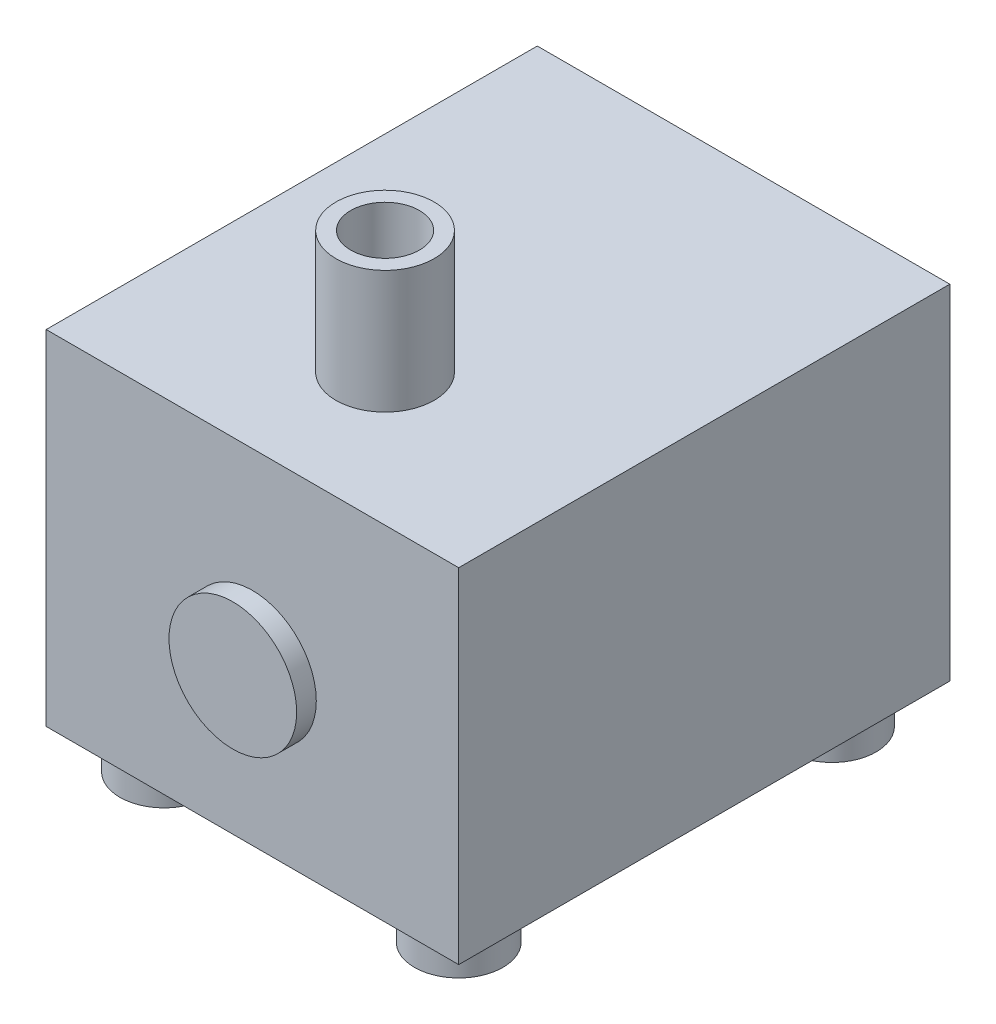
ISO-10303-21;
HEADER;
FILE_DESCRIPTION(('STEP AP214'),'2;1');
FILE_NAME('part.step','',(''),(''),'','','');
FILE_SCHEMA(('AUTOMOTIVE_DESIGN { 1 0 10303 214 1 1 1 1 }'));
ENDSEC;
DATA;
#1=APPLICATION_CONTEXT('core data for automotive mechanical design processes');
#2=APPLICATION_PROTOCOL_DEFINITION('international standard','automotive_design',2000,#1);
#3=PRODUCT_CONTEXT('',#1,'mechanical');
#4=PRODUCT('Part','Part','',(#3));
#5=PRODUCT_RELATED_PRODUCT_CATEGORY('part','',(#4));
#6=PRODUCT_DEFINITION_FORMATION('','',#4);
#7=PRODUCT_DEFINITION_CONTEXT('part definition',#1,'design');
#8=PRODUCT_DEFINITION('design','',#6,#7);
#9=PRODUCT_DEFINITION_SHAPE('','',#8);
#10=(LENGTH_UNIT() NAMED_UNIT(*) SI_UNIT(.MILLI.,.METRE.));
#11=(NAMED_UNIT(*) PLANE_ANGLE_UNIT() SI_UNIT($,.RADIAN.));
#12=(NAMED_UNIT(*) SI_UNIT($,.STERADIAN.) SOLID_ANGLE_UNIT());
#13=UNCERTAINTY_MEASURE_WITH_UNIT(LENGTH_MEASURE(1.E-05),#10,'distance_accuracy_value','');
#14=(GEOMETRIC_REPRESENTATION_CONTEXT(3) GLOBAL_UNCERTAINTY_ASSIGNED_CONTEXT((#13)) GLOBAL_UNIT_ASSIGNED_CONTEXT((#10,
#11,#12)) REPRESENTATION_CONTEXT('',''));
#15=CARTESIAN_POINT('',(0.,0.,0.));
#16=DIRECTION('',(0.,0.,1.));
#17=DIRECTION('',(1.,0.,0.));
#18=AXIS2_PLACEMENT_3D('',#15,#16,#17);
#19=CARTESIAN_POINT('',(0.,40.,54.));
#20=DIRECTION('',(0.,0.,-1.));
#21=DIRECTION('',(-1.,0.,0.));
#22=AXIS2_PLACEMENT_3D('',#19,#20,#21);
#23=CYLINDRICAL_SURFACE('',#22,13.);
#24=CARTESIAN_POINT('',(0.,40.,54.));
#25=DIRECTION('',(0.,0.,1.));
#26=DIRECTION('',(1.,0.,0.));
#27=AXIS2_PLACEMENT_3D('',#24,#25,#26);
#28=CIRCLE('',#27,13.);
#29=CARTESIAN_POINT('',(13.,40.,54.));
#30=VERTEX_POINT('',#29);
#31=EDGE_CURVE('E11',#30,#30,#28,.T.);
#32=ORIENTED_EDGE('',*,*,#31,.F.);
#33=EDGE_LOOP('',(#32));
#34=FACE_BOUND('',#33,.T.);
#35=CARTESIAN_POINT('',(0.,40.,50.));
#36=DIRECTION('',(0.,0.,1.));
#37=DIRECTION('',(1.,0.,0.));
#38=AXIS2_PLACEMENT_3D('',#35,#36,#37);
#39=CIRCLE('',#38,13.);
#40=CARTESIAN_POINT('',(13.,40.,50.));
#41=VERTEX_POINT('',#40);
#42=EDGE_CURVE('E54',#41,#41,#39,.T.);
#43=ORIENTED_EDGE('',*,*,#42,.T.);
#44=EDGE_LOOP('',(#43));
#45=FACE_BOUND('',#44,.T.);
#46=ADVANCED_FACE('F55',(#34,#45),#23,.T.);
#47=CARTESIAN_POINT('',(0.,40.,54.));
#48=DIRECTION('',(0.,0.,1.));
#49=DIRECTION('',(1.,0.,0.));
#50=AXIS2_PLACEMENT_3D('',#47,#48,#49);
#51=PLANE('',#50);
#52=ORIENTED_EDGE('',*,*,#31,.T.);
#53=EDGE_LOOP('',(#52));
#54=FACE_BOUND('',#53,.T.);
#55=ADVANCED_FACE('F67',(#54),#51,.T.);
#56=CARTESIAN_POINT('',(0.,40.,50.));
#57=DIRECTION('',(0.,0.,1.));
#58=DIRECTION('',(1.,0.,0.));
#59=AXIS2_PLACEMENT_3D('',#56,#57,#58);
#60=PLANE('',#59);
#61=ORIENTED_EDGE('',*,*,#42,.F.);
#62=EDGE_LOOP('',(#61));
#63=FACE_BOUND('',#62,.T.);
#64=ADVANCED_FACE('F70',(#63),#60,.F.);
#65=CLOSED_SHELL('',(#46,#55,#64));
#66=MANIFOLD_SOLID_BREP('B2',#65);
#67=CARTESIAN_POINT('',(0.,103.,23.));
#68=DIRECTION('',(0.,1.,0.));
#69=DIRECTION('',(0.,0.,1.));
#70=AXIS2_PLACEMENT_3D('',#67,#68,#69);
#71=PLANE('',#70);
#72=CARTESIAN_POINT('',(0.,103.,23.));
#73=DIRECTION('',(0.,1.,0.));
#74=DIRECTION('',(0.,0.,1.));
#75=AXIS2_PLACEMENT_3D('',#72,#73,#74);
#76=CIRCLE('',#75,10.);
#77=CARTESIAN_POINT('',(0.,103.,33.));
#78=VERTEX_POINT('',#77);
#79=EDGE_CURVE('E51',#78,#78,#76,.T.);
#80=ORIENTED_EDGE('',*,*,#79,.T.);
#81=EDGE_LOOP('',(#80));
#82=FACE_BOUND('',#81,.T.);
#83=CARTESIAN_POINT('',(0.,103.,23.));
#84=DIRECTION('',(0.,1.,0.));
#85=DIRECTION('',(0.,0.,1.));
#86=AXIS2_PLACEMENT_3D('',#83,#84,#85);
#87=CIRCLE('',#86,7.);
#88=CARTESIAN_POINT('',(0.,103.,30.));
#89=VERTEX_POINT('',#88);
#90=EDGE_CURVE('E119',#89,#89,#87,.T.);
#91=ORIENTED_EDGE('',*,*,#90,.F.);
#92=EDGE_LOOP('',(#91));
#93=FACE_BOUND('',#92,.T.);
#94=ADVANCED_FACE('F106',(#82,#93),#71,.T.);
#95=CARTESIAN_POINT('',(0.,78.,23.));
#96=DIRECTION('',(0.,1.,0.));
#97=DIRECTION('',(0.,0.,1.));
#98=AXIS2_PLACEMENT_3D('',#95,#96,#97);
#99=PLANE('',#98);
#100=CARTESIAN_POINT('',(0.,78.,23.));
#101=DIRECTION('',(0.,1.,0.));
#102=DIRECTION('',(0.,0.,1.));
#103=AXIS2_PLACEMENT_3D('',#100,#101,#102);
#104=CIRCLE('',#103,10.);
#105=CARTESIAN_POINT('',(0.,78.,33.));
#106=VERTEX_POINT('',#105);
#107=EDGE_CURVE('E109',#106,#106,#104,.T.);
#108=ORIENTED_EDGE('',*,*,#107,.F.);
#109=EDGE_LOOP('',(#108));
#110=FACE_BOUND('',#109,.T.);
#111=CARTESIAN_POINT('',(0.,78.,23.));
#112=DIRECTION('',(0.,1.,0.));
#113=DIRECTION('',(0.,0.,1.));
#114=AXIS2_PLACEMENT_3D('',#111,#112,#113);
#115=CIRCLE('',#114,7.);
#116=CARTESIAN_POINT('',(0.,78.,30.));
#117=VERTEX_POINT('',#116);
#118=EDGE_CURVE('E125',#117,#117,#115,.T.);
#119=ORIENTED_EDGE('',*,*,#118,.T.);
#120=EDGE_LOOP('',(#119));
#121=FACE_BOUND('',#120,.T.);
#122=ADVANCED_FACE('F131',(#110,#121),#99,.F.);
#123=CARTESIAN_POINT('',(0.,103.,23.));
#124=DIRECTION('',(0.,-1.,0.));
#125=DIRECTION('',(0.,0.,-1.));
#126=AXIS2_PLACEMENT_3D('',#123,#124,#125);
#127=CYLINDRICAL_SURFACE('',#126,10.);
#128=ORIENTED_EDGE('',*,*,#79,.F.);
#129=EDGE_LOOP('',(#128));
#130=FACE_BOUND('',#129,.T.);
#131=ORIENTED_EDGE('',*,*,#107,.T.);
#132=EDGE_LOOP('',(#131));
#133=FACE_BOUND('',#132,.T.);
#134=ADVANCED_FACE('F108',(#130,#133),#127,.T.);
#135=CARTESIAN_POINT('',(0.,103.,23.));
#136=DIRECTION('',(0.,-1.,0.));
#137=DIRECTION('',(0.,0.,-1.));
#138=AXIS2_PLACEMENT_3D('',#135,#136,#137);
#139=CYLINDRICAL_SURFACE('',#138,7.);
#140=ORIENTED_EDGE('',*,*,#90,.T.);
#141=EDGE_LOOP('',(#140));
#142=FACE_BOUND('',#141,.T.);
#143=ORIENTED_EDGE('',*,*,#118,.F.);
#144=EDGE_LOOP('',(#143));
#145=FACE_BOUND('',#144,.T.);
#146=ADVANCED_FACE('F126',(#142,#145),#139,.F.);
#147=CLOSED_SHELL('',(#94,#122,#134,#146));
#148=MANIFOLD_SOLID_BREP('B6',#147);
#149=CARTESIAN_POINT('',(30.,8.,-38.));
#150=DIRECTION('',(0.,-1.,0.));
#151=DIRECTION('',(0.,0.,-1.));
#152=AXIS2_PLACEMENT_3D('',#149,#150,#151);
#153=CYLINDRICAL_SURFACE('',#152,9.);
#154=CARTESIAN_POINT('',(30.,8.,-38.));
#155=DIRECTION('',(0.,1.,0.));
#156=DIRECTION('',(0.,0.,1.));
#157=AXIS2_PLACEMENT_3D('',#154,#155,#156);
#158=CIRCLE('',#157,9.);
#159=CARTESIAN_POINT('',(30.,8.,-29.));
#160=VERTEX_POINT('',#159);
#161=EDGE_CURVE('E102',#160,#160,#158,.T.);
#162=ORIENTED_EDGE('',*,*,#161,.F.);
#163=EDGE_LOOP('',(#162));
#164=FACE_BOUND('',#163,.T.);
#165=CARTESIAN_POINT('',(30.,0.,-38.));
#166=DIRECTION('',(0.,1.,0.));
#167=DIRECTION('',(0.,0.,1.));
#168=AXIS2_PLACEMENT_3D('',#165,#166,#167);
#169=CIRCLE('',#168,9.);
#170=CARTESIAN_POINT('',(30.,0.,-29.));
#171=VERTEX_POINT('',#170);
#172=EDGE_CURVE('E190',#171,#171,#169,.T.);
#173=ORIENTED_EDGE('',*,*,#172,.T.);
#174=EDGE_LOOP('',(#173));
#175=FACE_BOUND('',#174,.T.);
#176=ADVANCED_FACE('F183',(#164,#175),#153,.T.);
#177=CARTESIAN_POINT('',(30.,8.,-38.));
#178=DIRECTION('',(0.,1.,0.));
#179=DIRECTION('',(0.,0.,1.));
#180=AXIS2_PLACEMENT_3D('',#177,#178,#179);
#181=PLANE('',#180);
#182=ORIENTED_EDGE('',*,*,#161,.T.);
#183=EDGE_LOOP('',(#182));
#184=FACE_BOUND('',#183,.T.);
#185=ADVANCED_FACE('F201',(#184),#181,.T.);
#186=CARTESIAN_POINT('',(30.,0.,-38.));
#187=DIRECTION('',(0.,1.,0.));
#188=DIRECTION('',(0.,0.,1.));
#189=AXIS2_PLACEMENT_3D('',#186,#187,#188);
#190=PLANE('',#189);
#191=ORIENTED_EDGE('',*,*,#172,.F.);
#192=EDGE_LOOP('',(#191));
#193=FACE_BOUND('',#192,.T.);
#194=ADVANCED_FACE('F197',(#193),#190,.F.);
#195=CLOSED_SHELL('',(#176,#185,#194));
#196=MANIFOLD_SOLID_BREP('B46',#195);
#197=CARTESIAN_POINT('',(30.,8.,38.));
#198=DIRECTION('',(0.,-1.,0.));
#199=DIRECTION('',(0.,0.,-1.));
#200=AXIS2_PLACEMENT_3D('',#197,#198,#199);
#201=CYLINDRICAL_SURFACE('',#200,9.);
#202=CARTESIAN_POINT('',(30.,8.,38.));
#203=DIRECTION('',(0.,1.,0.));
#204=DIRECTION('',(0.,0.,1.));
#205=AXIS2_PLACEMENT_3D('',#202,#203,#204);
#206=CIRCLE('',#205,9.);
#207=CARTESIAN_POINT('',(30.,8.,47.));
#208=VERTEX_POINT('',#207);
#209=EDGE_CURVE('E182',#208,#208,#206,.T.);
#210=ORIENTED_EDGE('',*,*,#209,.F.);
#211=EDGE_LOOP('',(#210));
#212=FACE_BOUND('',#211,.T.);
#213=CARTESIAN_POINT('',(30.,0.,38.));
#214=DIRECTION('',(0.,1.,0.));
#215=DIRECTION('',(0.,0.,1.));
#216=AXIS2_PLACEMENT_3D('',#213,#214,#215);
#217=CIRCLE('',#216,9.);
#218=CARTESIAN_POINT('',(30.,0.,47.));
#219=VERTEX_POINT('',#218);
#220=EDGE_CURVE('E241',#219,#219,#217,.T.);
#221=ORIENTED_EDGE('',*,*,#220,.T.);
#222=EDGE_LOOP('',(#221));
#223=FACE_BOUND('',#222,.T.);
#224=ADVANCED_FACE('F238',(#212,#223),#201,.T.);
#225=CARTESIAN_POINT('',(30.,8.,38.));
#226=DIRECTION('',(0.,1.,0.));
#227=DIRECTION('',(0.,0.,1.));
#228=AXIS2_PLACEMENT_3D('',#225,#226,#227);
#229=PLANE('',#228);
#230=ORIENTED_EDGE('',*,*,#209,.T.);
#231=EDGE_LOOP('',(#230));
#232=FACE_BOUND('',#231,.T.);
#233=ADVANCED_FACE('F253',(#232),#229,.T.);
#234=CARTESIAN_POINT('',(30.,0.,38.));
#235=DIRECTION('',(0.,1.,0.));
#236=DIRECTION('',(0.,0.,1.));
#237=AXIS2_PLACEMENT_3D('',#234,#235,#236);
#238=PLANE('',#237);
#239=ORIENTED_EDGE('',*,*,#220,.F.);
#240=EDGE_LOOP('',(#239));
#241=FACE_BOUND('',#240,.T.);
#242=ADVANCED_FACE('F254',(#241),#238,.F.);
#243=CLOSED_SHELL('',(#224,#233,#242));
#244=MANIFOLD_SOLID_BREP('B99',#243);
#245=CARTESIAN_POINT('',(-30.,8.,-38.));
#246=DIRECTION('',(0.,-1.,0.));
#247=DIRECTION('',(0.,0.,-1.));
#248=AXIS2_PLACEMENT_3D('',#245,#246,#247);
#249=CYLINDRICAL_SURFACE('',#248,9.);
#250=CARTESIAN_POINT('',(-30.,8.,-38.));
#251=DIRECTION('',(0.,1.,0.));
#252=DIRECTION('',(0.,0.,1.));
#253=AXIS2_PLACEMENT_3D('',#250,#251,#252);
#254=CIRCLE('',#253,9.);
#255=CARTESIAN_POINT('',(-30.,8.,-29.));
#256=VERTEX_POINT('',#255);
#257=EDGE_CURVE('E240',#256,#256,#254,.T.);
#258=ORIENTED_EDGE('',*,*,#257,.F.);
#259=EDGE_LOOP('',(#258));
#260=FACE_BOUND('',#259,.T.);
#261=CARTESIAN_POINT('',(-30.,0.,-38.));
#262=DIRECTION('',(0.,1.,0.));
#263=DIRECTION('',(0.,0.,1.));
#264=AXIS2_PLACEMENT_3D('',#261,#262,#263);
#265=CIRCLE('',#264,9.);
#266=CARTESIAN_POINT('',(-30.,0.,-29.));
#267=VERTEX_POINT('',#266);
#268=EDGE_CURVE('E294',#267,#267,#265,.T.);
#269=ORIENTED_EDGE('',*,*,#268,.T.);
#270=EDGE_LOOP('',(#269));
#271=FACE_BOUND('',#270,.T.);
#272=ADVANCED_FACE('F292',(#260,#271),#249,.T.);
#273=CARTESIAN_POINT('',(-30.,8.,-38.));
#274=DIRECTION('',(0.,1.,0.));
#275=DIRECTION('',(0.,0.,1.));
#276=AXIS2_PLACEMENT_3D('',#273,#274,#275);
#277=PLANE('',#276);
#278=ORIENTED_EDGE('',*,*,#257,.T.);
#279=EDGE_LOOP('',(#278));
#280=FACE_BOUND('',#279,.T.);
#281=ADVANCED_FACE('F307',(#280),#277,.T.);
#282=CARTESIAN_POINT('',(-30.,0.,-38.));
#283=DIRECTION('',(0.,1.,0.));
#284=DIRECTION('',(0.,0.,1.));
#285=AXIS2_PLACEMENT_3D('',#282,#283,#284);
#286=PLANE('',#285);
#287=ORIENTED_EDGE('',*,*,#268,.F.);
#288=EDGE_LOOP('',(#287));
#289=FACE_BOUND('',#288,.T.);
#290=ADVANCED_FACE('F310',(#289),#286,.F.);
#291=CLOSED_SHELL('',(#272,#281,#290));
#292=MANIFOLD_SOLID_BREP('B178',#291);
#293=CARTESIAN_POINT('',(-30.,8.,38.));
#294=DIRECTION('',(0.,-1.,0.));
#295=DIRECTION('',(0.,0.,-1.));
#296=AXIS2_PLACEMENT_3D('',#293,#294,#295);
#297=CYLINDRICAL_SURFACE('',#296,9.);
#298=CARTESIAN_POINT('',(-30.,8.,38.));
#299=DIRECTION('',(0.,1.,0.));
#300=DIRECTION('',(0.,0.,1.));
#301=AXIS2_PLACEMENT_3D('',#298,#299,#300);
#302=CIRCLE('',#301,9.);
#303=CARTESIAN_POINT('',(-30.,8.,47.));
#304=VERTEX_POINT('',#303);
#305=EDGE_CURVE('E293',#304,#304,#302,.T.);
#306=ORIENTED_EDGE('',*,*,#305,.F.);
#307=EDGE_LOOP('',(#306));
#308=FACE_BOUND('',#307,.T.);
#309=CARTESIAN_POINT('',(-30.,0.,38.));
#310=DIRECTION('',(0.,1.,0.));
#311=DIRECTION('',(0.,0.,1.));
#312=AXIS2_PLACEMENT_3D('',#309,#310,#311);
#313=CIRCLE('',#312,9.);
#314=CARTESIAN_POINT('',(-30.,0.,47.));
#315=VERTEX_POINT('',#314);
#316=EDGE_CURVE('E349',#315,#315,#313,.T.);
#317=ORIENTED_EDGE('',*,*,#316,.T.);
#318=EDGE_LOOP('',(#317));
#319=FACE_BOUND('',#318,.T.);
#320=ADVANCED_FACE('F350',(#308,#319),#297,.T.);
#321=CARTESIAN_POINT('',(-30.,8.,38.));
#322=DIRECTION('',(0.,1.,0.));
#323=DIRECTION('',(0.,0.,1.));
#324=AXIS2_PLACEMENT_3D('',#321,#322,#323);
#325=PLANE('',#324);
#326=ORIENTED_EDGE('',*,*,#305,.T.);
#327=EDGE_LOOP('',(#326));
#328=FACE_BOUND('',#327,.T.);
#329=ADVANCED_FACE('F364',(#328),#325,.T.);
#330=CARTESIAN_POINT('',(-30.,0.,38.));
#331=DIRECTION('',(0.,1.,0.));
#332=DIRECTION('',(0.,0.,1.));
#333=AXIS2_PLACEMENT_3D('',#330,#331,#332);
#334=PLANE('',#333);
#335=ORIENTED_EDGE('',*,*,#316,.F.);
#336=EDGE_LOOP('',(#335));
#337=FACE_BOUND('',#336,.T.);
#338=ADVANCED_FACE('F365',(#337),#334,.F.);
#339=CLOSED_SHELL('',(#320,#329,#338));
#340=MANIFOLD_SOLID_BREP('B235',#339);
#341=CARTESIAN_POINT('',(-42.,78.,50.));
#342=DIRECTION('',(1.,0.,0.));
#343=DIRECTION('',(0.,0.,-1.));
#344=AXIS2_PLACEMENT_3D('',#341,#342,#343);
#345=PLANE('',#344);
#346=DIRECTION('',(0.,0.,1.));
#347=VECTOR('',#346,1.);
#348=CARTESIAN_POINT('',(-42.,8.,50.));
#349=LINE('',#348,#347);
#350=CARTESIAN_POINT('',(-42.,8.,-50.));
#351=VERTEX_POINT('',#350);
#352=CARTESIAN_POINT('',(-42.,8.,50.));
#353=VERTEX_POINT('',#352);
#354=EDGE_CURVE('E462',#351,#353,#349,.T.);
#355=ORIENTED_EDGE('',*,*,#354,.T.);
#356=DIRECTION('',(0.,-1.,0.));
#357=VECTOR('',#356,1.);
#358=CARTESIAN_POINT('',(-42.,78.,50.));
#359=LINE('',#358,#357);
#360=CARTESIAN_POINT('',(-42.,78.,50.));
#361=VERTEX_POINT('',#360);
#362=EDGE_CURVE('E343',#361,#353,#359,.T.);
#363=ORIENTED_EDGE('',*,*,#362,.F.);
#364=DIRECTION('',(0.,0.,1.));
#365=VECTOR('',#364,1.);
#366=CARTESIAN_POINT('',(-42.,78.,50.));
#367=LINE('',#366,#365);
#368=CARTESIAN_POINT('',(-42.,78.,-50.));
#369=VERTEX_POINT('',#368);
#370=EDGE_CURVE('E444',#369,#361,#367,.T.);
#371=ORIENTED_EDGE('',*,*,#370,.F.);
#372=DIRECTION('',(0.,-1.,0.));
#373=VECTOR('',#372,1.);
#374=CARTESIAN_POINT('',(-42.,78.,-50.));
#375=LINE('',#374,#373);
#376=EDGE_CURVE('E456',#369,#351,#375,.T.);
#377=ORIENTED_EDGE('',*,*,#376,.T.);
#378=EDGE_LOOP('',(#355,#363,#371,#377));
#379=FACE_BOUND('',#378,.T.);
#380=ADVANCED_FACE('F391',(#379),#345,.F.);
#381=CARTESIAN_POINT('',(-42.,78.,50.));
#382=DIRECTION('',(0.,0.,-1.));
#383=DIRECTION('',(-1.,0.,0.));
#384=AXIS2_PLACEMENT_3D('',#381,#382,#383);
#385=PLANE('',#384);
#386=DIRECTION('',(1.,0.,0.));
#387=VECTOR('',#386,1.);
#388=CARTESIAN_POINT('',(-42.,8.,50.));
#389=LINE('',#388,#387);
#390=CARTESIAN_POINT('',(42.,8.,50.));
#391=VERTEX_POINT('',#390);
#392=EDGE_CURVE('E448',#353,#391,#389,.T.);
#393=ORIENTED_EDGE('',*,*,#392,.T.);
#394=DIRECTION('',(0.,-1.,0.));
#395=VECTOR('',#394,1.);
#396=CARTESIAN_POINT('',(42.,78.,50.));
#397=LINE('',#396,#395);
#398=CARTESIAN_POINT('',(42.,78.,50.));
#399=VERTEX_POINT('',#398);
#400=EDGE_CURVE('E405',#399,#391,#397,.T.);
#401=ORIENTED_EDGE('',*,*,#400,.F.);
#402=DIRECTION('',(1.,0.,0.));
#403=VECTOR('',#402,1.);
#404=CARTESIAN_POINT('',(-42.,78.,50.));
#405=LINE('',#404,#403);
#406=EDGE_CURVE('E439',#361,#399,#405,.T.);
#407=ORIENTED_EDGE('',*,*,#406,.F.);
#408=ORIENTED_EDGE('',*,*,#362,.T.);
#409=EDGE_LOOP('',(#393,#401,#407,#408));
#410=FACE_BOUND('',#409,.T.);
#411=ADVANCED_FACE('F446',(#410),#385,.F.);
#412=CARTESIAN_POINT('',(42.,78.,50.));
#413=DIRECTION('',(-1.,0.,0.));
#414=DIRECTION('',(0.,0.,1.));
#415=AXIS2_PLACEMENT_3D('',#412,#413,#414);
#416=PLANE('',#415);
#417=DIRECTION('',(0.,0.,-1.));
#418=VECTOR('',#417,1.);
#419=CARTESIAN_POINT('',(42.,8.,50.));
#420=LINE('',#419,#418);
#421=CARTESIAN_POINT('',(42.,8.,-50.));
#422=VERTEX_POINT('',#421);
#423=EDGE_CURVE('E430',#391,#422,#420,.T.);
#424=ORIENTED_EDGE('',*,*,#423,.T.);
#425=DIRECTION('',(0.,-1.,0.));
#426=VECTOR('',#425,1.);
#427=CARTESIAN_POINT('',(42.,78.,-50.));
#428=LINE('',#427,#426);
#429=CARTESIAN_POINT('',(42.,78.,-50.));
#430=VERTEX_POINT('',#429);
#431=EDGE_CURVE('E455',#430,#422,#428,.T.);
#432=ORIENTED_EDGE('',*,*,#431,.F.);
#433=DIRECTION('',(0.,0.,-1.));
#434=VECTOR('',#433,1.);
#435=CARTESIAN_POINT('',(42.,78.,50.));
#436=LINE('',#435,#434);
#437=EDGE_CURVE('E442',#399,#430,#436,.T.);
#438=ORIENTED_EDGE('',*,*,#437,.F.);
#439=ORIENTED_EDGE('',*,*,#400,.T.);
#440=EDGE_LOOP('',(#424,#432,#438,#439));
#441=FACE_BOUND('',#440,.T.);
#442=ADVANCED_FACE('F454',(#441),#416,.F.);
#443=CARTESIAN_POINT('',(-42.,78.,-50.));
#444=DIRECTION('',(0.,0.,1.));
#445=DIRECTION('',(1.,0.,0.));
#446=AXIS2_PLACEMENT_3D('',#443,#444,#445);
#447=PLANE('',#446);
#448=DIRECTION('',(-1.,0.,0.));
#449=VECTOR('',#448,1.);
#450=CARTESIAN_POINT('',(-42.,8.,-50.));
#451=LINE('',#450,#449);
#452=EDGE_CURVE('E433',#422,#351,#451,.T.);
#453=ORIENTED_EDGE('',*,*,#452,.T.);
#454=ORIENTED_EDGE('',*,*,#376,.F.);
#455=DIRECTION('',(-1.,0.,0.));
#456=VECTOR('',#455,1.);
#457=CARTESIAN_POINT('',(-42.,78.,-50.));
#458=LINE('',#457,#456);
#459=EDGE_CURVE('E408',#430,#369,#458,.T.);
#460=ORIENTED_EDGE('',*,*,#459,.F.);
#461=ORIENTED_EDGE('',*,*,#431,.T.);
#462=EDGE_LOOP('',(#453,#454,#460,#461));
#463=FACE_BOUND('',#462,.T.);
#464=ADVANCED_FACE('F473',(#463),#447,.F.);
#465=CARTESIAN_POINT('',(0.,78.,0.));
#466=DIRECTION('',(0.,-1.,0.));
#467=DIRECTION('',(0.,0.,-1.));
#468=AXIS2_PLACEMENT_3D('',#465,#466,#467);
#469=PLANE('',#468);
#470=ORIENTED_EDGE('',*,*,#370,.T.);
#471=ORIENTED_EDGE('',*,*,#406,.T.);
#472=ORIENTED_EDGE('',*,*,#437,.T.);
#473=ORIENTED_EDGE('',*,*,#459,.T.);
#474=EDGE_LOOP('',(#470,#471,#472,#473));
#475=FACE_BOUND('',#474,.T.);
#476=ADVANCED_FACE('F441',(#475),#469,.F.);
#477=CARTESIAN_POINT('',(0.,8.,0.));
#478=DIRECTION('',(0.,-1.,0.));
#479=DIRECTION('',(0.,0.,-1.));
#480=AXIS2_PLACEMENT_3D('',#477,#478,#479);
#481=PLANE('',#480);
#482=ORIENTED_EDGE('',*,*,#354,.F.);
#483=ORIENTED_EDGE('',*,*,#452,.F.);
#484=ORIENTED_EDGE('',*,*,#423,.F.);
#485=ORIENTED_EDGE('',*,*,#392,.F.);
#486=EDGE_LOOP('',(#482,#483,#484,#485));
#487=FACE_BOUND('',#486,.T.);
#488=ADVANCED_FACE('F476',(#487),#481,.T.);
#489=CLOSED_SHELL('',(#380,#411,#442,#464,#476,#488));
#490=MANIFOLD_SOLID_BREP('B286',#489);
#491=ADVANCED_BREP_SHAPE_REPRESENTATION('',(#18,#66,#148,#196,#244,#292,#340,#490),#14);
#492=SHAPE_DEFINITION_REPRESENTATION(#9,#491);
ENDSEC;
END-ISO-10303-21;
